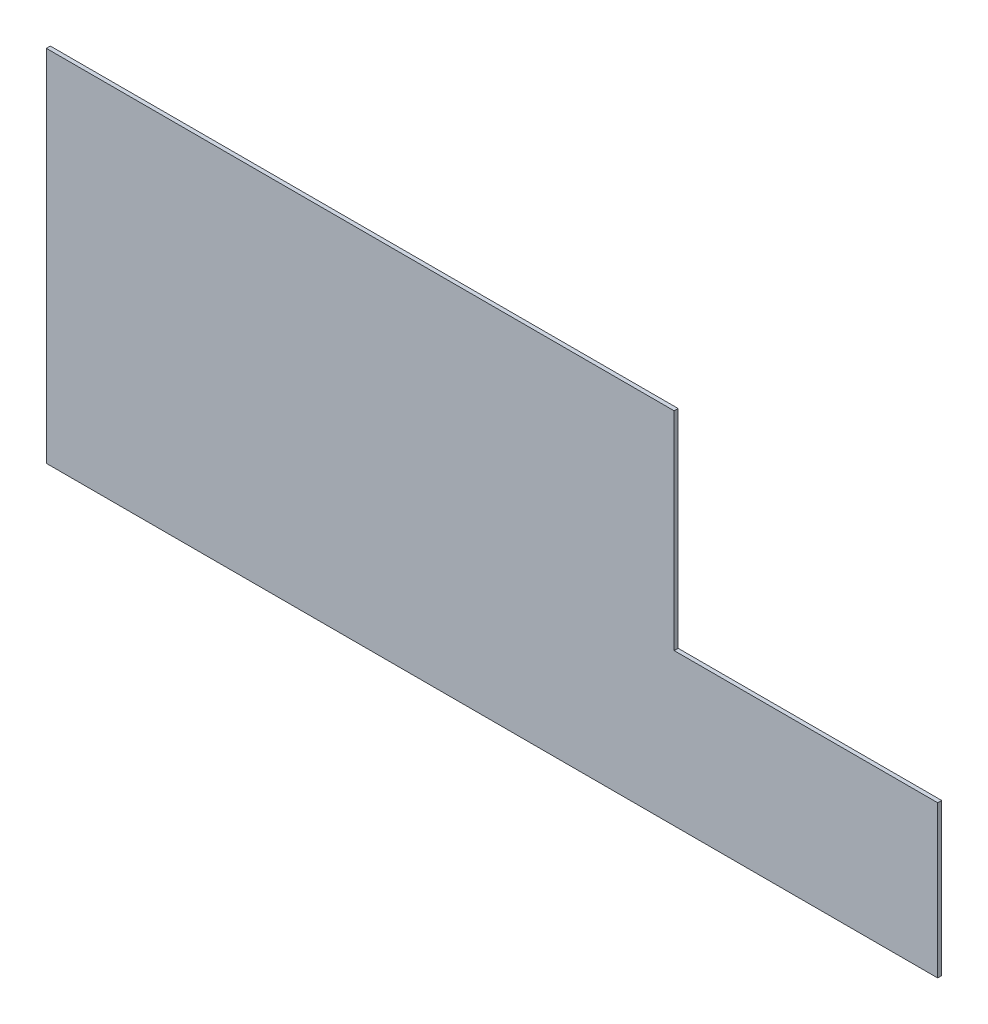
ISO-10303-21;
HEADER;
FILE_DESCRIPTION(('STEP AP214'),'2;1');
FILE_NAME('part.step','',(''),(''),'','','');
FILE_SCHEMA(('AUTOMOTIVE_DESIGN { 1 0 10303 214 1 1 1 1 }'));
ENDSEC;
DATA;
#1=APPLICATION_CONTEXT('core data for automotive mechanical design processes');
#2=APPLICATION_PROTOCOL_DEFINITION('international standard','automotive_design',2000,#1);
#3=PRODUCT_CONTEXT('',#1,'mechanical');
#4=PRODUCT('Part','Part','',(#3));
#5=PRODUCT_RELATED_PRODUCT_CATEGORY('part','',(#4));
#6=PRODUCT_DEFINITION_FORMATION('','',#4);
#7=PRODUCT_DEFINITION_CONTEXT('part definition',#1,'design');
#8=PRODUCT_DEFINITION('design','',#6,#7);
#9=PRODUCT_DEFINITION_SHAPE('','',#8);
#10=(LENGTH_UNIT() NAMED_UNIT(*) SI_UNIT(.MILLI.,.METRE.));
#11=(NAMED_UNIT(*) PLANE_ANGLE_UNIT() SI_UNIT($,.RADIAN.));
#12=(NAMED_UNIT(*) SI_UNIT($,.STERADIAN.) SOLID_ANGLE_UNIT());
#13=UNCERTAINTY_MEASURE_WITH_UNIT(LENGTH_MEASURE(1.E-05),#10,'distance_accuracy_value','');
#14=(GEOMETRIC_REPRESENTATION_CONTEXT(3) GLOBAL_UNCERTAINTY_ASSIGNED_CONTEXT((#13)) GLOBAL_UNIT_ASSIGNED_CONTEXT((#10,
#11,#12)) REPRESENTATION_CONTEXT('',''));
#15=CARTESIAN_POINT('',(0.,0.,0.));
#16=DIRECTION('',(0.,0.,1.));
#17=DIRECTION('',(1.,0.,0.));
#18=AXIS2_PLACEMENT_3D('',#15,#16,#17);
#19=CARTESIAN_POINT('',(279.,-112.5,2.5));
#20=DIRECTION('',(-1.,0.,0.));
#21=DIRECTION('',(0.,0.,1.));
#22=AXIS2_PLACEMENT_3D('',#19,#20,#21);
#23=PLANE('',#22);
#24=DIRECTION('',(0.,1.,0.));
#25=VECTOR('',#24,1.);
#26=CARTESIAN_POINT('',(279.,-112.5,0.));
#27=LINE('',#26,#25);
#28=CARTESIAN_POINT('',(279.,-112.5,0.));
#29=VERTEX_POINT('',#28);
#30=CARTESIAN_POINT('',(279.,-17.5,0.));
#31=VERTEX_POINT('',#30);
#32=EDGE_CURVE('E125',#29,#31,#27,.T.);
#33=ORIENTED_EDGE('',*,*,#32,.T.);
#34=DIRECTION('',(0.,0.,-1.));
#35=VECTOR('',#34,1.);
#36=CARTESIAN_POINT('',(279.,-17.5,10.));
#37=LINE('',#36,#35);
#38=CARTESIAN_POINT('',(279.,-17.5,2.5));
#39=VERTEX_POINT('',#38);
#40=EDGE_CURVE('E51',#39,#31,#37,.T.);
#41=ORIENTED_EDGE('',*,*,#40,.F.);
#42=DIRECTION('',(0.,1.,0.));
#43=VECTOR('',#42,1.);
#44=CARTESIAN_POINT('',(279.,-112.5,2.5));
#45=LINE('',#44,#43);
#46=CARTESIAN_POINT('',(279.,-112.5,2.5));
#47=VERTEX_POINT('',#46);
#48=EDGE_CURVE('E126',#47,#39,#45,.T.);
#49=ORIENTED_EDGE('',*,*,#48,.F.);
#50=DIRECTION('',(0.,0.,-1.));
#51=VECTOR('',#50,1.);
#52=CARTESIAN_POINT('',(279.,-112.5,2.5));
#53=LINE('',#52,#51);
#54=EDGE_CURVE('E132',#47,#29,#53,.T.);
#55=ORIENTED_EDGE('',*,*,#54,.T.);
#56=EDGE_LOOP('',(#33,#41,#49,#55));
#57=FACE_BOUND('',#56,.T.);
#58=ADVANCED_FACE('F37',(#57),#23,.F.);
#59=CARTESIAN_POINT('',(279.,112.5,2.5));
#60=DIRECTION('',(0.,-1.,0.));
#61=DIRECTION('',(1.,0.,0.));
#62=AXIS2_PLACEMENT_3D('',#59,#60,#61);
#63=PLANE('',#62);
#64=DIRECTION('',(-1.,0.,0.));
#65=VECTOR('',#64,1.);
#66=CARTESIAN_POINT('',(279.,112.5,2.5));
#67=LINE('',#66,#65);
#68=CARTESIAN_POINT('',(114.,112.5,2.5));
#69=VERTEX_POINT('',#68);
#70=CARTESIAN_POINT('',(-279.,112.5,2.5));
#71=VERTEX_POINT('',#70);
#72=EDGE_CURVE('E82',#69,#71,#67,.T.);
#73=ORIENTED_EDGE('',*,*,#72,.F.);
#74=DIRECTION('',(0.,0.,-1.));
#75=VECTOR('',#74,1.);
#76=CARTESIAN_POINT('',(114.,112.5,10.));
#77=LINE('',#76,#75);
#78=CARTESIAN_POINT('',(114.,112.5,0.));
#79=VERTEX_POINT('',#78);
#80=EDGE_CURVE('E106',#69,#79,#77,.T.);
#81=ORIENTED_EDGE('',*,*,#80,.T.);
#82=DIRECTION('',(-1.,0.,0.));
#83=VECTOR('',#82,1.);
#84=CARTESIAN_POINT('',(279.,112.5,0.));
#85=LINE('',#84,#83);
#86=CARTESIAN_POINT('',(-279.,112.5,0.));
#87=VERTEX_POINT('',#86);
#88=EDGE_CURVE('E117',#79,#87,#85,.T.);
#89=ORIENTED_EDGE('',*,*,#88,.T.);
#90=DIRECTION('',(0.,0.,-1.));
#91=VECTOR('',#90,1.);
#92=CARTESIAN_POINT('',(-279.,112.5,2.5));
#93=LINE('',#92,#91);
#94=EDGE_CURVE('E11',#71,#87,#93,.T.);
#95=ORIENTED_EDGE('',*,*,#94,.F.);
#96=EDGE_LOOP('',(#73,#81,#89,#95));
#97=FACE_BOUND('',#96,.T.);
#98=ADVANCED_FACE('F146',(#97),#63,.F.);
#99=CARTESIAN_POINT('',(-279.,-112.5,2.5));
#100=DIRECTION('',(1.,0.,0.));
#101=DIRECTION('',(0.,0.,-1.));
#102=AXIS2_PLACEMENT_3D('',#99,#100,#101);
#103=PLANE('',#102);
#104=DIRECTION('',(0.,-1.,0.));
#105=VECTOR('',#104,1.);
#106=CARTESIAN_POINT('',(-279.,-112.5,0.));
#107=LINE('',#106,#105);
#108=CARTESIAN_POINT('',(-279.,-112.5,0.));
#109=VERTEX_POINT('',#108);
#110=EDGE_CURVE('E135',#87,#109,#107,.T.);
#111=ORIENTED_EDGE('',*,*,#110,.T.);
#112=DIRECTION('',(0.,0.,-1.));
#113=VECTOR('',#112,1.);
#114=CARTESIAN_POINT('',(-279.,-112.5,2.5));
#115=LINE('',#114,#113);
#116=CARTESIAN_POINT('',(-279.,-112.5,2.5));
#117=VERTEX_POINT('',#116);
#118=EDGE_CURVE('E44',#117,#109,#115,.T.);
#119=ORIENTED_EDGE('',*,*,#118,.F.);
#120=DIRECTION('',(0.,-1.,0.));
#121=VECTOR('',#120,1.);
#122=CARTESIAN_POINT('',(-279.,-112.5,2.5));
#123=LINE('',#122,#121);
#124=EDGE_CURVE('E129',#71,#117,#123,.T.);
#125=ORIENTED_EDGE('',*,*,#124,.F.);
#126=ORIENTED_EDGE('',*,*,#94,.T.);
#127=EDGE_LOOP('',(#111,#119,#125,#126));
#128=FACE_BOUND('',#127,.T.);
#129=ADVANCED_FACE('F147',(#128),#103,.F.);
#130=CARTESIAN_POINT('',(279.,-112.5,2.5));
#131=DIRECTION('',(0.,1.,0.));
#132=DIRECTION('',(-1.,0.,0.));
#133=AXIS2_PLACEMENT_3D('',#130,#131,#132);
#134=PLANE('',#133);
#135=DIRECTION('',(1.,0.,0.));
#136=VECTOR('',#135,1.);
#137=CARTESIAN_POINT('',(279.,-112.5,0.));
#138=LINE('',#137,#136);
#139=EDGE_CURVE('E77',#109,#29,#138,.T.);
#140=ORIENTED_EDGE('',*,*,#139,.T.);
#141=ORIENTED_EDGE('',*,*,#54,.F.);
#142=DIRECTION('',(1.,0.,0.));
#143=VECTOR('',#142,1.);
#144=CARTESIAN_POINT('',(279.,-112.5,2.5));
#145=LINE('',#144,#143);
#146=EDGE_CURVE('E60',#117,#47,#145,.T.);
#147=ORIENTED_EDGE('',*,*,#146,.F.);
#148=ORIENTED_EDGE('',*,*,#118,.T.);
#149=EDGE_LOOP('',(#140,#141,#147,#148));
#150=FACE_BOUND('',#149,.T.);
#151=ADVANCED_FACE('F139',(#150),#134,.F.);
#152=CARTESIAN_POINT('',(0.,0.,2.5));
#153=DIRECTION('',(0.,0.,1.));
#154=DIRECTION('',(1.,0.,0.));
#155=AXIS2_PLACEMENT_3D('',#152,#153,#154);
#156=PLANE('',#155);
#157=DIRECTION('',(0.,-1.,0.));
#158=VECTOR('',#157,1.);
#159=CARTESIAN_POINT('',(114.,0.,2.5));
#160=LINE('',#159,#158);
#161=CARTESIAN_POINT('',(114.,-17.5,2.5));
#162=VERTEX_POINT('',#161);
#163=EDGE_CURVE('E104',#69,#162,#160,.T.);
#164=ORIENTED_EDGE('',*,*,#163,.F.);
#165=ORIENTED_EDGE('',*,*,#72,.T.);
#166=ORIENTED_EDGE('',*,*,#124,.T.);
#167=ORIENTED_EDGE('',*,*,#146,.T.);
#168=ORIENTED_EDGE('',*,*,#48,.T.);
#169=DIRECTION('',(1.,0.,0.));
#170=VECTOR('',#169,1.);
#171=CARTESIAN_POINT('',(0.,-17.5,2.5));
#172=LINE('',#171,#170);
#173=EDGE_CURVE('E121',#162,#39,#172,.T.);
#174=ORIENTED_EDGE('',*,*,#173,.F.);
#175=EDGE_LOOP('',(#164,#165,#166,#167,#168,#174));
#176=FACE_BOUND('',#175,.T.);
#177=ADVANCED_FACE('F144',(#176),#156,.T.);
#178=CARTESIAN_POINT('',(0.,0.,0.));
#179=DIRECTION('',(0.,0.,1.));
#180=DIRECTION('',(1.,0.,0.));
#181=AXIS2_PLACEMENT_3D('',#178,#179,#180);
#182=PLANE('',#181);
#183=ORIENTED_EDGE('',*,*,#88,.F.);
#184=DIRECTION('',(0.,1.,0.));
#185=VECTOR('',#184,1.);
#186=CARTESIAN_POINT('',(114.,112.5,0.));
#187=LINE('',#186,#185);
#188=CARTESIAN_POINT('',(114.,-17.5,0.));
#189=VERTEX_POINT('',#188);
#190=EDGE_CURVE('E102',#189,#79,#187,.T.);
#191=ORIENTED_EDGE('',*,*,#190,.F.);
#192=DIRECTION('',(-1.,0.,0.));
#193=VECTOR('',#192,1.);
#194=CARTESIAN_POINT('',(279.,-17.5,0.));
#195=LINE('',#194,#193);
#196=EDGE_CURVE('E108',#31,#189,#195,.T.);
#197=ORIENTED_EDGE('',*,*,#196,.F.);
#198=ORIENTED_EDGE('',*,*,#32,.F.);
#199=ORIENTED_EDGE('',*,*,#139,.F.);
#200=ORIENTED_EDGE('',*,*,#110,.F.);
#201=EDGE_LOOP('',(#183,#191,#197,#198,#199,#200));
#202=FACE_BOUND('',#201,.T.);
#203=ADVANCED_FACE('F115',(#202),#182,.F.);
#204=CARTESIAN_POINT('',(114.,112.5,10.));
#205=DIRECTION('',(-1.,0.,0.));
#206=DIRECTION('',(0.,-1.,0.));
#207=AXIS2_PLACEMENT_3D('',#204,#205,#206);
#208=PLANE('',#207);
#209=ORIENTED_EDGE('',*,*,#163,.T.);
#210=DIRECTION('',(0.,0.,-1.));
#211=VECTOR('',#210,1.);
#212=CARTESIAN_POINT('',(114.,-17.5,10.));
#213=LINE('',#212,#211);
#214=EDGE_CURVE('E99',#162,#189,#213,.T.);
#215=ORIENTED_EDGE('',*,*,#214,.T.);
#216=ORIENTED_EDGE('',*,*,#190,.T.);
#217=ORIENTED_EDGE('',*,*,#80,.F.);
#218=EDGE_LOOP('',(#209,#215,#216,#217));
#219=FACE_BOUND('',#218,.T.);
#220=ADVANCED_FACE('F100',(#219),#208,.F.);
#221=CARTESIAN_POINT('',(279.,-17.5,10.));
#222=DIRECTION('',(0.,-1.,0.));
#223=DIRECTION('',(0.,0.,-1.));
#224=AXIS2_PLACEMENT_3D('',#221,#222,#223);
#225=PLANE('',#224);
#226=ORIENTED_EDGE('',*,*,#173,.T.);
#227=ORIENTED_EDGE('',*,*,#40,.T.);
#228=ORIENTED_EDGE('',*,*,#196,.T.);
#229=ORIENTED_EDGE('',*,*,#214,.F.);
#230=EDGE_LOOP('',(#226,#227,#228,#229));
#231=FACE_BOUND('',#230,.T.);
#232=ADVANCED_FACE('F109',(#231),#225,.F.);
#233=CLOSED_SHELL('',(#58,#98,#129,#151,#177,#203,#220,#232));
#234=MANIFOLD_SOLID_BREP('B2',#233);
#235=ADVANCED_BREP_SHAPE_REPRESENTATION('',(#18,#234),#14);
#236=SHAPE_DEFINITION_REPRESENTATION(#9,#235);
ENDSEC;
END-ISO-10303-21;
